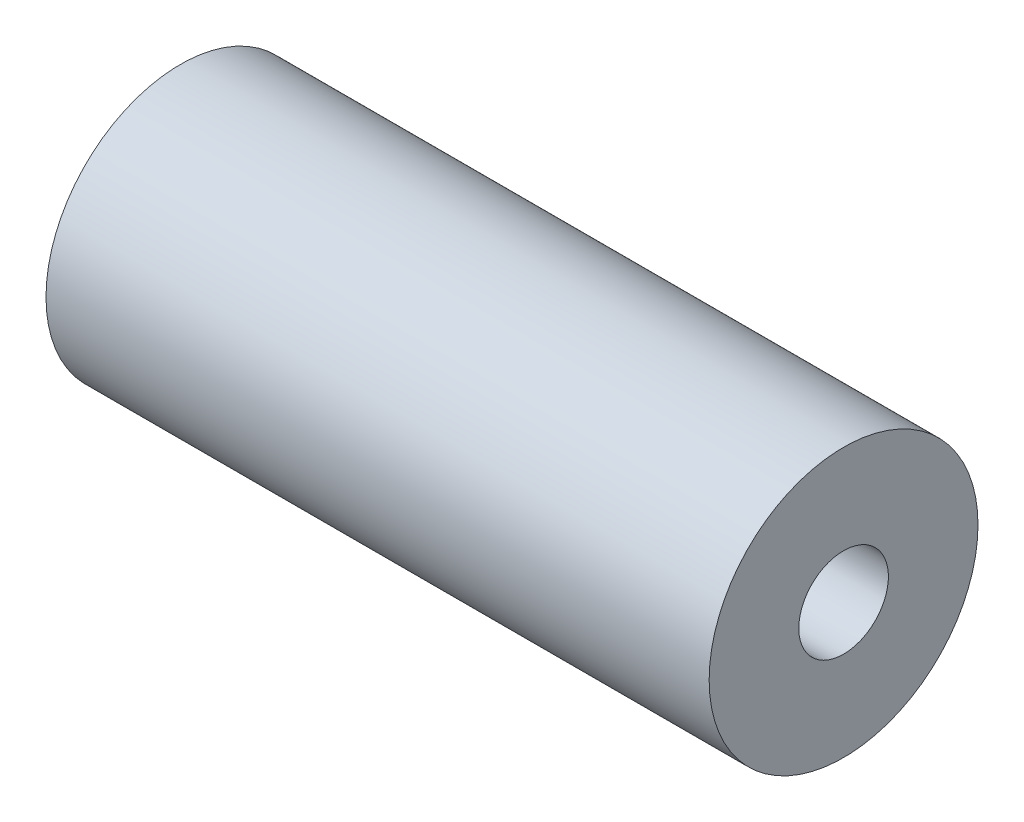
ISO-10303-21;
HEADER;
FILE_DESCRIPTION(('STEP AP214'),'2;1');
FILE_NAME('part.step','',(''),(''),'','','');
FILE_SCHEMA(('AUTOMOTIVE_DESIGN { 1 0 10303 214 1 1 1 1 }'));
ENDSEC;
DATA;
#1=APPLICATION_CONTEXT('core data for automotive mechanical design processes');
#2=APPLICATION_PROTOCOL_DEFINITION('international standard','automotive_design',2000,#1);
#3=PRODUCT_CONTEXT('',#1,'mechanical');
#4=PRODUCT('Part','Part','',(#3));
#5=PRODUCT_RELATED_PRODUCT_CATEGORY('part','',(#4));
#6=PRODUCT_DEFINITION_FORMATION('','',#4);
#7=PRODUCT_DEFINITION_CONTEXT('part definition',#1,'design');
#8=PRODUCT_DEFINITION('design','',#6,#7);
#9=PRODUCT_DEFINITION_SHAPE('','',#8);
#10=(LENGTH_UNIT() NAMED_UNIT(*) SI_UNIT(.MILLI.,.METRE.));
#11=(NAMED_UNIT(*) PLANE_ANGLE_UNIT() SI_UNIT($,.RADIAN.));
#12=(NAMED_UNIT(*) SI_UNIT($,.STERADIAN.) SOLID_ANGLE_UNIT());
#13=UNCERTAINTY_MEASURE_WITH_UNIT(LENGTH_MEASURE(1.E-05),#10,'distance_accuracy_value','');
#14=(GEOMETRIC_REPRESENTATION_CONTEXT(3) GLOBAL_UNCERTAINTY_ASSIGNED_CONTEXT((#13)) GLOBAL_UNIT_ASSIGNED_CONTEXT((#10,
#11,#12)) REPRESENTATION_CONTEXT('',''));
#15=CARTESIAN_POINT('',(0.,0.,0.));
#16=DIRECTION('',(0.,0.,1.));
#17=DIRECTION('',(1.,0.,0.));
#18=AXIS2_PLACEMENT_3D('',#15,#16,#17);
#19=CARTESIAN_POINT('',(-140.,7.5,0.));
#20=DIRECTION('',(1.,0.,0.));
#21=DIRECTION('',(0.,0.,-1.));
#22=AXIS2_PLACEMENT_3D('',#19,#20,#21);
#23=PLANE('',#22);
#24=CARTESIAN_POINT('',(-140.,0.,0.));
#25=DIRECTION('',(-1.,0.,0.));
#26=DIRECTION('',(0.,0.,1.));
#27=AXIS2_PLACEMENT_3D('',#24,#25,#26);
#28=CIRCLE('',#27,2.5);
#29=CARTESIAN_POINT('',(-140.,0.,2.5));
#30=VERTEX_POINT('',#29);
#31=EDGE_CURVE('E10',#30,#30,#28,.T.);
#32=ORIENTED_EDGE('',*,*,#31,.F.);
#33=EDGE_LOOP('',(#32));
#34=FACE_BOUND('',#33,.T.);
#35=CARTESIAN_POINT('',(-140.,0.,0.));
#36=DIRECTION('',(-1.,0.,0.));
#37=DIRECTION('',(0.,0.,1.));
#38=AXIS2_PLACEMENT_3D('',#35,#36,#37);
#39=CIRCLE('',#38,7.5);
#40=CARTESIAN_POINT('',(-140.,0.,7.5));
#41=VERTEX_POINT('',#40);
#42=EDGE_CURVE('E45',#41,#41,#39,.T.);
#43=ORIENTED_EDGE('',*,*,#42,.T.);
#44=EDGE_LOOP('',(#43));
#45=FACE_BOUND('',#44,.T.);
#46=ADVANCED_FACE('F31',(#34,#45),#23,.F.);
#47=CARTESIAN_POINT('',(-110.,0.,0.));
#48=DIRECTION('',(-1.,0.,0.));
#49=DIRECTION('',(0.,0.,1.));
#50=AXIS2_PLACEMENT_3D('',#47,#48,#49);
#51=CYLINDRICAL_SURFACE('',#50,2.5);
#52=CARTESIAN_POINT('',(-103.,0.,0.));
#53=DIRECTION('',(-1.,0.,0.));
#54=DIRECTION('',(0.,0.,1.));
#55=AXIS2_PLACEMENT_3D('',#52,#53,#54);
#56=CIRCLE('',#55,2.5);
#57=CARTESIAN_POINT('',(-103.,0.,2.5));
#58=VERTEX_POINT('',#57);
#59=EDGE_CURVE('E37',#58,#58,#56,.T.);
#60=ORIENTED_EDGE('',*,*,#59,.F.);
#61=EDGE_LOOP('',(#60));
#62=FACE_BOUND('',#61,.T.);
#63=ORIENTED_EDGE('',*,*,#31,.T.);
#64=EDGE_LOOP('',(#63));
#65=FACE_BOUND('',#64,.T.);
#66=ADVANCED_FACE('F60',(#62,#65),#51,.F.);
#67=CARTESIAN_POINT('',(-103.,2.5,0.));
#68=DIRECTION('',(-1.,0.,0.));
#69=DIRECTION('',(0.,0.,1.));
#70=AXIS2_PLACEMENT_3D('',#67,#68,#69);
#71=PLANE('',#70);
#72=CARTESIAN_POINT('',(-103.,0.,0.));
#73=DIRECTION('',(-1.,0.,0.));
#74=DIRECTION('',(0.,0.,1.));
#75=AXIS2_PLACEMENT_3D('',#72,#73,#74);
#76=CIRCLE('',#75,7.5);
#77=CARTESIAN_POINT('',(-103.,0.,7.5));
#78=VERTEX_POINT('',#77);
#79=EDGE_CURVE('E41',#78,#78,#76,.T.);
#80=ORIENTED_EDGE('',*,*,#79,.F.);
#81=EDGE_LOOP('',(#80));
#82=FACE_BOUND('',#81,.T.);
#83=ORIENTED_EDGE('',*,*,#59,.T.);
#84=EDGE_LOOP('',(#83));
#85=FACE_BOUND('',#84,.T.);
#86=ADVANCED_FACE('F55',(#82,#85),#71,.F.);
#87=CARTESIAN_POINT('',(-110.,0.,0.));
#88=DIRECTION('',(-1.,0.,0.));
#89=DIRECTION('',(0.,0.,1.));
#90=AXIS2_PLACEMENT_3D('',#87,#88,#89);
#91=CYLINDRICAL_SURFACE('',#90,7.5);
#92=ORIENTED_EDGE('',*,*,#42,.F.);
#93=EDGE_LOOP('',(#92));
#94=FACE_BOUND('',#93,.T.);
#95=ORIENTED_EDGE('',*,*,#79,.T.);
#96=EDGE_LOOP('',(#95));
#97=FACE_BOUND('',#96,.T.);
#98=ADVANCED_FACE('F52',(#94,#97),#91,.T.);
#99=CLOSED_SHELL('',(#46,#66,#86,#98));
#100=MANIFOLD_SOLID_BREP('B2',#99);
#101=ADVANCED_BREP_SHAPE_REPRESENTATION('',(#18,#100),#14);
#102=SHAPE_DEFINITION_REPRESENTATION(#9,#101);
ENDSEC;
END-ISO-10303-21;
